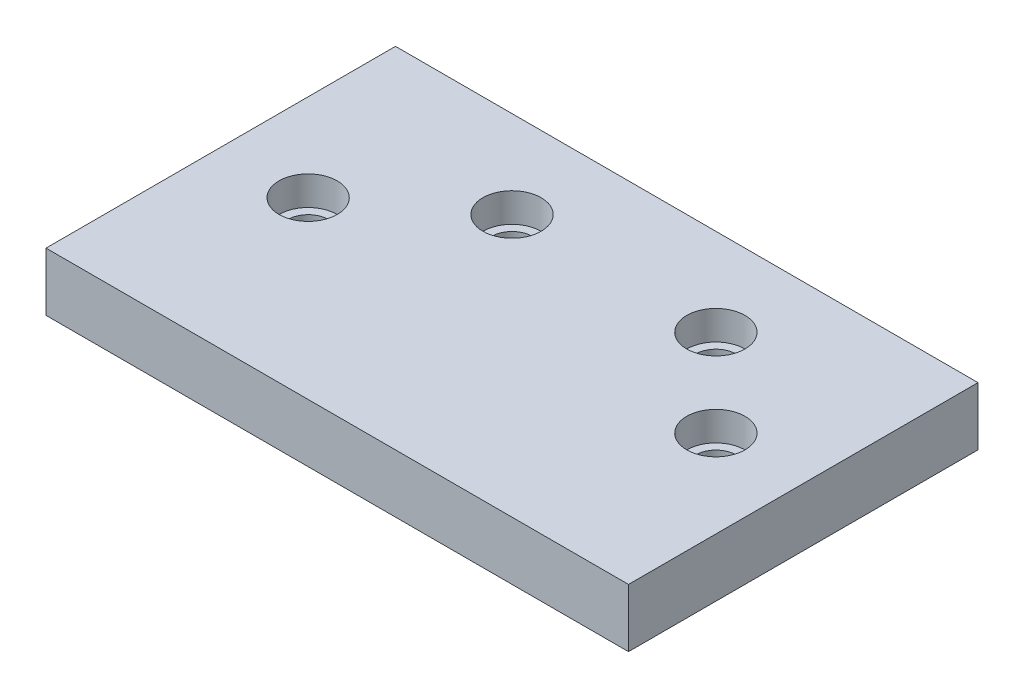
ISO-10303-21;
HEADER;
FILE_DESCRIPTION(('STEP AP214'),'2;1');
FILE_NAME('part.step','',(''),(''),'','','');
FILE_SCHEMA(('AUTOMOTIVE_DESIGN { 1 0 10303 214 1 1 1 1 }'));
ENDSEC;
DATA;
#1=APPLICATION_CONTEXT('core data for automotive mechanical design processes');
#2=APPLICATION_PROTOCOL_DEFINITION('international standard','automotive_design',2000,#1);
#3=PRODUCT_CONTEXT('',#1,'mechanical');
#4=PRODUCT('Part','Part','',(#3));
#5=PRODUCT_RELATED_PRODUCT_CATEGORY('part','',(#4));
#6=PRODUCT_DEFINITION_FORMATION('','',#4);
#7=PRODUCT_DEFINITION_CONTEXT('part definition',#1,'design');
#8=PRODUCT_DEFINITION('design','',#6,#7);
#9=PRODUCT_DEFINITION_SHAPE('','',#8);
#10=(LENGTH_UNIT() NAMED_UNIT(*) SI_UNIT(.MILLI.,.METRE.));
#11=(NAMED_UNIT(*) PLANE_ANGLE_UNIT() SI_UNIT($,.RADIAN.));
#12=(NAMED_UNIT(*) SI_UNIT($,.STERADIAN.) SOLID_ANGLE_UNIT());
#13=UNCERTAINTY_MEASURE_WITH_UNIT(LENGTH_MEASURE(1.E-05),#10,'distance_accuracy_value','');
#14=(GEOMETRIC_REPRESENTATION_CONTEXT(3) GLOBAL_UNCERTAINTY_ASSIGNED_CONTEXT((#13)) GLOBAL_UNIT_ASSIGNED_CONTEXT((#10,
#11,#12)) REPRESENTATION_CONTEXT('',''));
#15=CARTESIAN_POINT('',(0.,0.,0.));
#16=DIRECTION('',(0.,0.,1.));
#17=DIRECTION('',(1.,0.,0.));
#18=AXIS2_PLACEMENT_3D('',#15,#16,#17);
#19=CARTESIAN_POINT('',(14.,2.,3.));
#20=DIRECTION('',(0.,-1.,0.));
#21=DIRECTION('',(0.,0.,-1.));
#22=AXIS2_PLACEMENT_3D('',#19,#20,#21);
#23=CYLINDRICAL_SURFACE('',#22,0.7);
#24=CARTESIAN_POINT('',(14.,0.,3.));
#25=DIRECTION('',(0.,1.,0.));
#26=DIRECTION('',(0.,0.,1.));
#27=AXIS2_PLACEMENT_3D('',#24,#25,#26);
#28=CIRCLE('',#27,0.7);
#29=CARTESIAN_POINT('',(14.,0.,3.7));
#30=VERTEX_POINT('',#29);
#31=EDGE_CURVE('E164',#30,#30,#28,.T.);
#32=ORIENTED_EDGE('',*,*,#31,.F.);
#33=EDGE_LOOP('',(#32));
#34=FACE_BOUND('',#33,.T.);
#35=CARTESIAN_POINT('',(14.,1.,3.));
#36=DIRECTION('',(0.,1.,0.));
#37=DIRECTION('',(0.,0.,1.));
#38=AXIS2_PLACEMENT_3D('',#35,#36,#37);
#39=CIRCLE('',#38,0.7);
#40=CARTESIAN_POINT('',(14.,1.,3.7));
#41=VERTEX_POINT('',#40);
#42=EDGE_CURVE('E99',#41,#41,#39,.T.);
#43=ORIENTED_EDGE('',*,*,#42,.T.);
#44=EDGE_LOOP('',(#43));
#45=FACE_BOUND('',#44,.T.);
#46=ADVANCED_FACE('F95',(#34,#45),#23,.F.);
#47=CARTESIAN_POINT('',(17.,2.,6.));
#48=DIRECTION('',(0.,-1.,0.));
#49=DIRECTION('',(0.,0.,-1.));
#50=AXIS2_PLACEMENT_3D('',#47,#48,#49);
#51=CYLINDRICAL_SURFACE('',#50,0.699999999999998);
#52=CARTESIAN_POINT('',(17.,0.,6.));
#53=DIRECTION('',(0.,1.,0.));
#54=DIRECTION('',(0.,0.,1.));
#55=AXIS2_PLACEMENT_3D('',#52,#53,#54);
#56=CIRCLE('',#55,0.699999999999998);
#57=CARTESIAN_POINT('',(17.,0.,6.7));
#58=VERTEX_POINT('',#57);
#59=EDGE_CURVE('E193',#58,#58,#56,.T.);
#60=ORIENTED_EDGE('',*,*,#59,.F.);
#61=EDGE_LOOP('',(#60));
#62=FACE_BOUND('',#61,.T.);
#63=CARTESIAN_POINT('',(17.,1.,6.));
#64=DIRECTION('',(0.,1.,0.));
#65=DIRECTION('',(0.,0.,1.));
#66=AXIS2_PLACEMENT_3D('',#63,#64,#65);
#67=CIRCLE('',#66,0.699999999999998);
#68=CARTESIAN_POINT('',(17.,1.,6.7));
#69=VERTEX_POINT('',#68);
#70=EDGE_CURVE('E179',#69,#69,#67,.T.);
#71=ORIENTED_EDGE('',*,*,#70,.T.);
#72=EDGE_LOOP('',(#71));
#73=FACE_BOUND('',#72,.T.);
#74=ADVANCED_FACE('F208',(#62,#73),#51,.F.);
#75=CARTESIAN_POINT('',(7.,2.,3.));
#76=DIRECTION('',(0.,-1.,0.));
#77=DIRECTION('',(0.,0.,-1.));
#78=AXIS2_PLACEMENT_3D('',#75,#76,#77);
#79=CYLINDRICAL_SURFACE('',#78,0.700000000000001);
#80=CARTESIAN_POINT('',(7.,0.,3.));
#81=DIRECTION('',(0.,1.,0.));
#82=DIRECTION('',(0.,0.,1.));
#83=AXIS2_PLACEMENT_3D('',#80,#81,#82);
#84=CIRCLE('',#83,0.700000000000001);
#85=CARTESIAN_POINT('',(7.,0.,3.7));
#86=VERTEX_POINT('',#85);
#87=EDGE_CURVE('E188',#86,#86,#84,.T.);
#88=ORIENTED_EDGE('',*,*,#87,.F.);
#89=EDGE_LOOP('',(#88));
#90=FACE_BOUND('',#89,.T.);
#91=CARTESIAN_POINT('',(7.,1.,3.));
#92=DIRECTION('',(0.,1.,0.));
#93=DIRECTION('',(0.,0.,1.));
#94=AXIS2_PLACEMENT_3D('',#91,#92,#93);
#95=CIRCLE('',#94,0.700000000000001);
#96=CARTESIAN_POINT('',(7.,1.,3.7));
#97=VERTEX_POINT('',#96);
#98=EDGE_CURVE('E176',#97,#97,#95,.T.);
#99=ORIENTED_EDGE('',*,*,#98,.T.);
#100=EDGE_LOOP('',(#99));
#101=FACE_BOUND('',#100,.T.);
#102=ADVANCED_FACE('F213',(#90,#101),#79,.F.);
#103=CARTESIAN_POINT('',(3.,2.,6.));
#104=DIRECTION('',(0.,-1.,0.));
#105=DIRECTION('',(0.,0.,-1.));
#106=AXIS2_PLACEMENT_3D('',#103,#104,#105);
#107=CYLINDRICAL_SURFACE('',#106,0.7);
#108=CARTESIAN_POINT('',(3.,0.,6.));
#109=DIRECTION('',(0.,1.,0.));
#110=DIRECTION('',(0.,0.,1.));
#111=AXIS2_PLACEMENT_3D('',#108,#109,#110);
#112=CIRCLE('',#111,0.7);
#113=CARTESIAN_POINT('',(3.,0.,6.7));
#114=VERTEX_POINT('',#113);
#115=EDGE_CURVE('E184',#114,#114,#112,.T.);
#116=ORIENTED_EDGE('',*,*,#115,.F.);
#117=EDGE_LOOP('',(#116));
#118=FACE_BOUND('',#117,.T.);
#119=CARTESIAN_POINT('',(3.,1.,6.));
#120=DIRECTION('',(0.,1.,0.));
#121=DIRECTION('',(0.,0.,1.));
#122=AXIS2_PLACEMENT_3D('',#119,#120,#121);
#123=CIRCLE('',#122,0.7);
#124=CARTESIAN_POINT('',(3.,1.,6.7));
#125=VERTEX_POINT('',#124);
#126=EDGE_CURVE('E173',#125,#125,#123,.T.);
#127=ORIENTED_EDGE('',*,*,#126,.T.);
#128=EDGE_LOOP('',(#127));
#129=FACE_BOUND('',#128,.T.);
#130=ADVANCED_FACE('F220',(#118,#129),#107,.F.);
#131=CARTESIAN_POINT('',(0.,2.,0.));
#132=DIRECTION('',(0.,1.,0.));
#133=DIRECTION('',(0.,0.,1.));
#134=AXIS2_PLACEMENT_3D('',#131,#132,#133);
#135=PLANE('',#134);
#136=CARTESIAN_POINT('',(3.,2.,6.));
#137=DIRECTION('',(0.,1.,0.));
#138=DIRECTION('',(0.,0.,1.));
#139=AXIS2_PLACEMENT_3D('',#136,#137,#138);
#140=CIRCLE('',#139,1.);
#141=CARTESIAN_POINT('',(3.,2.,7.));
#142=VERTEX_POINT('',#141);
#143=EDGE_CURVE('E387',#142,#142,#140,.T.);
#144=ORIENTED_EDGE('',*,*,#143,.F.);
#145=EDGE_LOOP('',(#144));
#146=FACE_BOUND('',#145,.T.);
#147=CARTESIAN_POINT('',(7.,2.,3.));
#148=DIRECTION('',(0.,1.,0.));
#149=DIRECTION('',(0.,0.,1.));
#150=AXIS2_PLACEMENT_3D('',#147,#148,#149);
#151=CIRCLE('',#150,1.);
#152=CARTESIAN_POINT('',(7.,2.,4.));
#153=VERTEX_POINT('',#152);
#154=EDGE_CURVE('E384',#153,#153,#151,.T.);
#155=ORIENTED_EDGE('',*,*,#154,.F.);
#156=EDGE_LOOP('',(#155));
#157=FACE_BOUND('',#156,.T.);
#158=CARTESIAN_POINT('',(14.,2.,3.));
#159=DIRECTION('',(0.,1.,0.));
#160=DIRECTION('',(0.,0.,1.));
#161=AXIS2_PLACEMENT_3D('',#158,#159,#160);
#162=CIRCLE('',#161,1.);
#163=CARTESIAN_POINT('',(14.,2.,4.));
#164=VERTEX_POINT('',#163);
#165=EDGE_CURVE('E374',#164,#164,#162,.T.);
#166=ORIENTED_EDGE('',*,*,#165,.F.);
#167=EDGE_LOOP('',(#166));
#168=FACE_BOUND('',#167,.T.);
#169=CARTESIAN_POINT('',(17.,2.,6.));
#170=DIRECTION('',(0.,1.,0.));
#171=DIRECTION('',(0.,0.,1.));
#172=AXIS2_PLACEMENT_3D('',#169,#170,#171);
#173=CIRCLE('',#172,1.);
#174=CARTESIAN_POINT('',(17.,2.,7.));
#175=VERTEX_POINT('',#174);
#176=EDGE_CURVE('E375',#175,#175,#173,.T.);
#177=ORIENTED_EDGE('',*,*,#176,.F.);
#178=EDGE_LOOP('',(#177));
#179=FACE_BOUND('',#178,.T.);
#180=DIRECTION('',(0.,0.,1.));
#181=VECTOR('',#180,1.);
#182=CARTESIAN_POINT('',(0.,2.,0.));
#183=LINE('',#182,#181);
#184=CARTESIAN_POINT('',(0.,2.,0.));
#185=VERTEX_POINT('',#184);
#186=CARTESIAN_POINT('',(0.,2.,12.));
#187=VERTEX_POINT('',#186);
#188=EDGE_CURVE('E147',#185,#187,#183,.T.);
#189=ORIENTED_EDGE('',*,*,#188,.T.);
#190=DIRECTION('',(1.,0.,0.));
#191=VECTOR('',#190,1.);
#192=CARTESIAN_POINT('',(0.,2.,12.));
#193=LINE('',#192,#191);
#194=CARTESIAN_POINT('',(20.,2.,12.));
#195=VERTEX_POINT('',#194);
#196=EDGE_CURVE('E139',#187,#195,#193,.T.);
#197=ORIENTED_EDGE('',*,*,#196,.T.);
#198=DIRECTION('',(0.,0.,1.));
#199=VECTOR('',#198,1.);
#200=CARTESIAN_POINT('',(20.,2.,0.));
#201=LINE('',#200,#199);
#202=CARTESIAN_POINT('',(20.,2.,0.));
#203=VERTEX_POINT('',#202);
#204=EDGE_CURVE('E146',#203,#195,#201,.T.);
#205=ORIENTED_EDGE('',*,*,#204,.F.);
#206=DIRECTION('',(1.,0.,0.));
#207=VECTOR('',#206,1.);
#208=CARTESIAN_POINT('',(0.,2.,0.));
#209=LINE('',#208,#207);
#210=EDGE_CURVE('E157',#185,#203,#209,.T.);
#211=ORIENTED_EDGE('',*,*,#210,.F.);
#212=EDGE_LOOP('',(#189,#197,#205,#211));
#213=FACE_BOUND('',#212,.T.);
#214=ADVANCED_FACE('F143',(#146,#157,#168,#179,#213),#135,.T.);
#215=CARTESIAN_POINT('',(0.,0.,0.));
#216=DIRECTION('',(0.,1.,0.));
#217=DIRECTION('',(0.,0.,1.));
#218=AXIS2_PLACEMENT_3D('',#215,#216,#217);
#219=PLANE('',#218);
#220=DIRECTION('',(0.,0.,1.));
#221=VECTOR('',#220,1.);
#222=CARTESIAN_POINT('',(0.,0.,0.));
#223=LINE('',#222,#221);
#224=CARTESIAN_POINT('',(0.,0.,0.));
#225=VERTEX_POINT('',#224);
#226=CARTESIAN_POINT('',(0.,0.,12.));
#227=VERTEX_POINT('',#226);
#228=EDGE_CURVE('E162',#225,#227,#223,.T.);
#229=ORIENTED_EDGE('',*,*,#228,.F.);
#230=DIRECTION('',(1.,0.,0.));
#231=VECTOR('',#230,1.);
#232=CARTESIAN_POINT('',(0.,0.,0.));
#233=LINE('',#232,#231);
#234=CARTESIAN_POINT('',(20.,0.,0.));
#235=VERTEX_POINT('',#234);
#236=EDGE_CURVE('E168',#225,#235,#233,.T.);
#237=ORIENTED_EDGE('',*,*,#236,.T.);
#238=DIRECTION('',(0.,0.,1.));
#239=VECTOR('',#238,1.);
#240=CARTESIAN_POINT('',(20.,0.,0.));
#241=LINE('',#240,#239);
#242=CARTESIAN_POINT('',(20.,0.,12.));
#243=VERTEX_POINT('',#242);
#244=EDGE_CURVE('E166',#235,#243,#241,.T.);
#245=ORIENTED_EDGE('',*,*,#244,.T.);
#246=DIRECTION('',(1.,0.,0.));
#247=VECTOR('',#246,1.);
#248=CARTESIAN_POINT('',(0.,0.,12.));
#249=LINE('',#248,#247);
#250=EDGE_CURVE('E152',#227,#243,#249,.T.);
#251=ORIENTED_EDGE('',*,*,#250,.F.);
#252=EDGE_LOOP('',(#229,#237,#245,#251));
#253=FACE_BOUND('',#252,.T.);
#254=ORIENTED_EDGE('',*,*,#31,.T.);
#255=EDGE_LOOP('',(#254));
#256=FACE_BOUND('',#255,.T.);
#257=ORIENTED_EDGE('',*,*,#59,.T.);
#258=EDGE_LOOP('',(#257));
#259=FACE_BOUND('',#258,.T.);
#260=ORIENTED_EDGE('',*,*,#87,.T.);
#261=EDGE_LOOP('',(#260));
#262=FACE_BOUND('',#261,.T.);
#263=ORIENTED_EDGE('',*,*,#115,.T.);
#264=EDGE_LOOP('',(#263));
#265=FACE_BOUND('',#264,.T.);
#266=ADVANCED_FACE('F204',(#253,#256,#259,#262,#265),#219,.F.);
#267=CARTESIAN_POINT('',(0.,2.,0.));
#268=DIRECTION('',(1.,0.,0.));
#269=DIRECTION('',(0.,0.,-1.));
#270=AXIS2_PLACEMENT_3D('',#267,#268,#269);
#271=PLANE('',#270);
#272=ORIENTED_EDGE('',*,*,#228,.T.);
#273=DIRECTION('',(0.,-1.,0.));
#274=VECTOR('',#273,1.);
#275=CARTESIAN_POINT('',(0.,2.,12.));
#276=LINE('',#275,#274);
#277=EDGE_CURVE('E12',#187,#227,#276,.T.);
#278=ORIENTED_EDGE('',*,*,#277,.F.);
#279=ORIENTED_EDGE('',*,*,#188,.F.);
#280=DIRECTION('',(0.,-1.,0.));
#281=VECTOR('',#280,1.);
#282=CARTESIAN_POINT('',(0.,2.,0.));
#283=LINE('',#282,#281);
#284=EDGE_CURVE('E114',#185,#225,#283,.T.);
#285=ORIENTED_EDGE('',*,*,#284,.T.);
#286=EDGE_LOOP('',(#272,#278,#279,#285));
#287=FACE_BOUND('',#286,.T.);
#288=ADVANCED_FACE('F97',(#287),#271,.F.);
#289=CARTESIAN_POINT('',(0.,2.,12.));
#290=DIRECTION('',(0.,0.,-1.));
#291=DIRECTION('',(-1.,0.,0.));
#292=AXIS2_PLACEMENT_3D('',#289,#290,#291);
#293=PLANE('',#292);
#294=ORIENTED_EDGE('',*,*,#250,.T.);
#295=DIRECTION('',(0.,-1.,0.));
#296=VECTOR('',#295,1.);
#297=CARTESIAN_POINT('',(20.,2.,12.));
#298=LINE('',#297,#296);
#299=EDGE_CURVE('E105',#195,#243,#298,.T.);
#300=ORIENTED_EDGE('',*,*,#299,.F.);
#301=ORIENTED_EDGE('',*,*,#196,.F.);
#302=ORIENTED_EDGE('',*,*,#277,.T.);
#303=EDGE_LOOP('',(#294,#300,#301,#302));
#304=FACE_BOUND('',#303,.T.);
#305=ADVANCED_FACE('F151',(#304),#293,.F.);
#306=CARTESIAN_POINT('',(20.,2.,0.));
#307=DIRECTION('',(1.,0.,0.));
#308=DIRECTION('',(0.,0.,-1.));
#309=AXIS2_PLACEMENT_3D('',#306,#307,#308);
#310=PLANE('',#309);
#311=ORIENTED_EDGE('',*,*,#244,.F.);
#312=DIRECTION('',(0.,-1.,0.));
#313=VECTOR('',#312,1.);
#314=CARTESIAN_POINT('',(20.,2.,0.));
#315=LINE('',#314,#313);
#316=EDGE_CURVE('E128',#203,#235,#315,.T.);
#317=ORIENTED_EDGE('',*,*,#316,.F.);
#318=ORIENTED_EDGE('',*,*,#204,.T.);
#319=ORIENTED_EDGE('',*,*,#299,.T.);
#320=EDGE_LOOP('',(#311,#317,#318,#319));
#321=FACE_BOUND('',#320,.T.);
#322=ADVANCED_FACE('F156',(#321),#310,.T.);
#323=CARTESIAN_POINT('',(0.,2.,0.));
#324=DIRECTION('',(0.,0.,-1.));
#325=DIRECTION('',(-1.,0.,0.));
#326=AXIS2_PLACEMENT_3D('',#323,#324,#325);
#327=PLANE('',#326);
#328=ORIENTED_EDGE('',*,*,#236,.F.);
#329=ORIENTED_EDGE('',*,*,#284,.F.);
#330=ORIENTED_EDGE('',*,*,#210,.T.);
#331=ORIENTED_EDGE('',*,*,#316,.T.);
#332=EDGE_LOOP('',(#328,#329,#330,#331));
#333=FACE_BOUND('',#332,.T.);
#334=ADVANCED_FACE('F225',(#333),#327,.T.);
#335=CARTESIAN_POINT('',(3.,1.,6.));
#336=DIRECTION('',(0.,1.,0.));
#337=DIRECTION('',(0.,0.,1.));
#338=AXIS2_PLACEMENT_3D('',#335,#336,#337);
#339=CYLINDRICAL_SURFACE('',#338,1.);
#340=CARTESIAN_POINT('',(3.,1.,6.));
#341=DIRECTION('',(0.,1.,0.));
#342=DIRECTION('',(0.,0.,1.));
#343=AXIS2_PLACEMENT_3D('',#340,#341,#342);
#344=CIRCLE('',#343,1.);
#345=CARTESIAN_POINT('',(3.,1.,7.));
#346=VERTEX_POINT('',#345);
#347=EDGE_CURVE('E177',#346,#346,#344,.T.);
#348=ORIENTED_EDGE('',*,*,#347,.F.);
#349=EDGE_LOOP('',(#348));
#350=FACE_BOUND('',#349,.T.);
#351=ORIENTED_EDGE('',*,*,#143,.T.);
#352=EDGE_LOOP('',(#351));
#353=FACE_BOUND('',#352,.T.);
#354=ADVANCED_FACE('F228',(#350,#353),#339,.F.);
#355=CARTESIAN_POINT('',(3.,1.,6.));
#356=DIRECTION('',(0.,1.,0.));
#357=DIRECTION('',(0.,0.,1.));
#358=AXIS2_PLACEMENT_3D('',#355,#356,#357);
#359=PLANE('',#358);
#360=ORIENTED_EDGE('',*,*,#126,.F.);
#361=EDGE_LOOP('',(#360));
#362=FACE_BOUND('',#361,.T.);
#363=ORIENTED_EDGE('',*,*,#347,.T.);
#364=EDGE_LOOP('',(#363));
#365=FACE_BOUND('',#364,.T.);
#366=ADVANCED_FACE('F296',(#362,#365),#359,.T.);
#367=CARTESIAN_POINT('',(7.,1.,3.));
#368=DIRECTION('',(0.,1.,0.));
#369=DIRECTION('',(0.,0.,1.));
#370=AXIS2_PLACEMENT_3D('',#367,#368,#369);
#371=CYLINDRICAL_SURFACE('',#370,1.);
#372=CARTESIAN_POINT('',(7.,1.,3.));
#373=DIRECTION('',(0.,1.,0.));
#374=DIRECTION('',(0.,0.,1.));
#375=AXIS2_PLACEMENT_3D('',#372,#373,#374);
#376=CIRCLE('',#375,1.);
#377=CARTESIAN_POINT('',(7.,1.,4.));
#378=VERTEX_POINT('',#377);
#379=EDGE_CURVE('E378',#378,#378,#376,.T.);
#380=ORIENTED_EDGE('',*,*,#379,.F.);
#381=EDGE_LOOP('',(#380));
#382=FACE_BOUND('',#381,.T.);
#383=ORIENTED_EDGE('',*,*,#154,.T.);
#384=EDGE_LOOP('',(#383));
#385=FACE_BOUND('',#384,.T.);
#386=ADVANCED_FACE('F303',(#382,#385),#371,.F.);
#387=CARTESIAN_POINT('',(7.,1.,3.));
#388=DIRECTION('',(0.,1.,0.));
#389=DIRECTION('',(0.,0.,1.));
#390=AXIS2_PLACEMENT_3D('',#387,#388,#389);
#391=PLANE('',#390);
#392=ORIENTED_EDGE('',*,*,#98,.F.);
#393=EDGE_LOOP('',(#392));
#394=FACE_BOUND('',#393,.T.);
#395=ORIENTED_EDGE('',*,*,#379,.T.);
#396=EDGE_LOOP('',(#395));
#397=FACE_BOUND('',#396,.T.);
#398=ADVANCED_FACE('F311',(#394,#397),#391,.T.);
#399=CARTESIAN_POINT('',(17.,1.,6.));
#400=DIRECTION('',(0.,1.,0.));
#401=DIRECTION('',(0.,0.,1.));
#402=AXIS2_PLACEMENT_3D('',#399,#400,#401);
#403=CYLINDRICAL_SURFACE('',#402,1.);
#404=CARTESIAN_POINT('',(17.,1.,6.));
#405=DIRECTION('',(0.,1.,0.));
#406=DIRECTION('',(0.,0.,1.));
#407=AXIS2_PLACEMENT_3D('',#404,#405,#406);
#408=CIRCLE('',#407,1.);
#409=CARTESIAN_POINT('',(17.,1.,7.));
#410=VERTEX_POINT('',#409);
#411=EDGE_CURVE('E196',#410,#410,#408,.T.);
#412=ORIENTED_EDGE('',*,*,#411,.F.);
#413=EDGE_LOOP('',(#412));
#414=FACE_BOUND('',#413,.T.);
#415=ORIENTED_EDGE('',*,*,#176,.T.);
#416=EDGE_LOOP('',(#415));
#417=FACE_BOUND('',#416,.T.);
#418=ADVANCED_FACE('F319',(#414,#417),#403,.F.);
#419=CARTESIAN_POINT('',(17.,1.,6.));
#420=DIRECTION('',(0.,1.,0.));
#421=DIRECTION('',(0.,0.,1.));
#422=AXIS2_PLACEMENT_3D('',#419,#420,#421);
#423=PLANE('',#422);
#424=ORIENTED_EDGE('',*,*,#70,.F.);
#425=EDGE_LOOP('',(#424));
#426=FACE_BOUND('',#425,.T.);
#427=ORIENTED_EDGE('',*,*,#411,.T.);
#428=EDGE_LOOP('',(#427));
#429=FACE_BOUND('',#428,.T.);
#430=ADVANCED_FACE('F327',(#426,#429),#423,.T.);
#431=CARTESIAN_POINT('',(14.,1.,3.));
#432=DIRECTION('',(0.,1.,0.));
#433=DIRECTION('',(0.,0.,1.));
#434=AXIS2_PLACEMENT_3D('',#431,#432,#433);
#435=CYLINDRICAL_SURFACE('',#434,1.);
#436=CARTESIAN_POINT('',(14.,1.,3.));
#437=DIRECTION('',(0.,1.,0.));
#438=DIRECTION('',(0.,0.,1.));
#439=AXIS2_PLACEMENT_3D('',#436,#437,#438);
#440=CIRCLE('',#439,1.);
#441=CARTESIAN_POINT('',(14.,1.,4.));
#442=VERTEX_POINT('',#441);
#443=EDGE_CURVE('E373',#442,#442,#440,.T.);
#444=ORIENTED_EDGE('',*,*,#443,.F.);
#445=EDGE_LOOP('',(#444));
#446=FACE_BOUND('',#445,.T.);
#447=ORIENTED_EDGE('',*,*,#165,.T.);
#448=EDGE_LOOP('',(#447));
#449=FACE_BOUND('',#448,.T.);
#450=ADVANCED_FACE('F335',(#446,#449),#435,.F.);
#451=CARTESIAN_POINT('',(14.,1.,3.));
#452=DIRECTION('',(0.,1.,0.));
#453=DIRECTION('',(0.,0.,1.));
#454=AXIS2_PLACEMENT_3D('',#451,#452,#453);
#455=PLANE('',#454);
#456=ORIENTED_EDGE('',*,*,#42,.F.);
#457=EDGE_LOOP('',(#456));
#458=FACE_BOUND('',#457,.T.);
#459=ORIENTED_EDGE('',*,*,#443,.T.);
#460=EDGE_LOOP('',(#459));
#461=FACE_BOUND('',#460,.T.);
#462=ADVANCED_FACE('F343',(#458,#461),#455,.T.);
#463=CLOSED_SHELL('',(#46,#74,#102,#130,#214,#266,#288,#305,#322,#334,#354,#366,#386,#398,#418,
#430,#450,#462));
#464=MANIFOLD_SOLID_BREP('B2',#463);
#465=ADVANCED_BREP_SHAPE_REPRESENTATION('',(#18,#464),#14);
#466=SHAPE_DEFINITION_REPRESENTATION(#9,#465);
ENDSEC;
END-ISO-10303-21;
